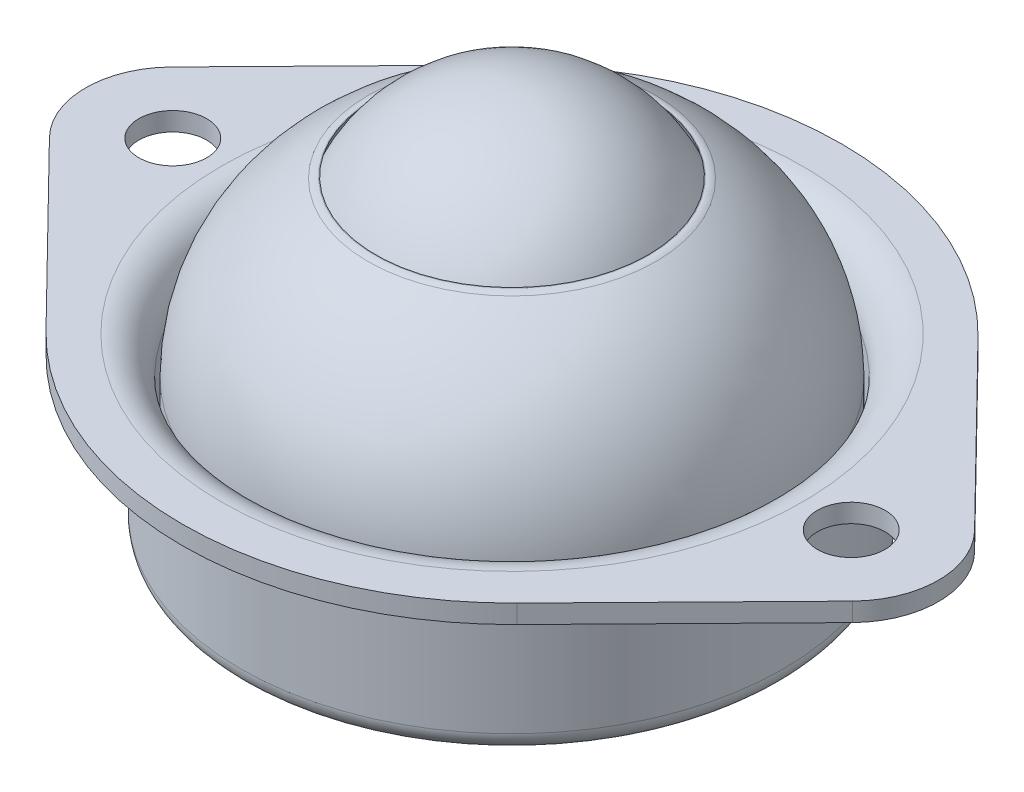
ISO-10303-21;
HEADER;
FILE_DESCRIPTION(('STEP AP214'),'2;1');
FILE_NAME('part.step','',(''),(''),'','','');
FILE_SCHEMA(('AUTOMOTIVE_DESIGN { 1 0 10303 214 1 1 1 1 }'));
ENDSEC;
DATA;
#1=APPLICATION_CONTEXT('core data for automotive mechanical design processes');
#2=APPLICATION_PROTOCOL_DEFINITION('international standard','automotive_design',2000,#1);
#3=PRODUCT_CONTEXT('',#1,'mechanical');
#4=PRODUCT('Part','Part','',(#3));
#5=PRODUCT_RELATED_PRODUCT_CATEGORY('part','',(#4));
#6=PRODUCT_DEFINITION_FORMATION('','',#4);
#7=PRODUCT_DEFINITION_CONTEXT('part definition',#1,'design');
#8=PRODUCT_DEFINITION('design','',#6,#7);
#9=PRODUCT_DEFINITION_SHAPE('','',#8);
#10=(LENGTH_UNIT() NAMED_UNIT(*) SI_UNIT(.MILLI.,.METRE.));
#11=(NAMED_UNIT(*) PLANE_ANGLE_UNIT() SI_UNIT($,.RADIAN.));
#12=(NAMED_UNIT(*) SI_UNIT($,.STERADIAN.) SOLID_ANGLE_UNIT());
#13=UNCERTAINTY_MEASURE_WITH_UNIT(LENGTH_MEASURE(1.E-05),#10,'distance_accuracy_value','');
#14=(GEOMETRIC_REPRESENTATION_CONTEXT(3) GLOBAL_UNCERTAINTY_ASSIGNED_CONTEXT((#13)) GLOBAL_UNIT_ASSIGNED_CONTEXT((#10,
#11,#12)) REPRESENTATION_CONTEXT('',''));
#15=CARTESIAN_POINT('',(0.,0.,0.));
#16=DIRECTION('',(0.,0.,1.));
#17=DIRECTION('',(1.,0.,0.));
#18=AXIS2_PLACEMENT_3D('',#15,#16,#17);
#19=CARTESIAN_POINT('',(0.,6.35,0.));
#20=DIRECTION('',(0.,1.,0.));
#21=DIRECTION('',(-1.,0.,0.));
#22=AXIS2_PLACEMENT_3D('',#19,#20,#21);
#23=SPHERICAL_SURFACE('',#22,12.7);
#24=CARTESIAN_POINT('',(0.,19.05,0.));
#25=VERTEX_POINT('',#24);
#26=VERTEX_LOOP('',#25);
#27=FACE_BOUND('',#26,.T.);
#28=ADVANCED_FACE('F50',(#27),#23,.T.);
#29=CLOSED_SHELL('',(#28));
#30=MANIFOLD_SOLID_BREP('B2',#29);
#31=CARTESIAN_POINT('',(0.,12.7,0.));
#32=DIRECTION('',(0.,-1.,0.));
#33=DIRECTION('',(1.,0.,0.));
#34=AXIS2_PLACEMENT_3D('',#31,#32,#33);
#35=PLANE('',#34);
#36=CARTESIAN_POINT('',(0.,12.7,0.));
#37=DIRECTION('',(0.,-1.,0.));
#38=DIRECTION('',(1.,0.,0.));
#39=AXIS2_PLACEMENT_3D('',#36,#37,#38);
#40=CIRCLE('',#39,11.2033802291708);
#41=CARTESIAN_POINT('',(11.2033802291708,12.7,0.));
#42=VERTEX_POINT('',#41);
#43=EDGE_CURVE('E74',#42,#42,#40,.F.);
#44=ORIENTED_EDGE('',*,*,#43,.T.);
#45=EDGE_LOOP('',(#44));
#46=FACE_BOUND('',#45,.T.);
#47=CARTESIAN_POINT('',(0.,12.7,0.));
#48=DIRECTION('',(0.,-1.,0.));
#49=DIRECTION('',(1.,0.,0.));
#50=AXIS2_PLACEMENT_3D('',#47,#48,#49);
#51=CIRCLE('',#50,11.1449283981549);
#52=CARTESIAN_POINT('',(11.1449283981549,12.7,0.));
#53=VERTEX_POINT('',#52);
#54=EDGE_CURVE('E218',#53,#53,#51,.F.);
#55=ORIENTED_EDGE('',*,*,#54,.F.);
#56=EDGE_LOOP('',(#55));
#57=FACE_BOUND('',#56,.T.);
#58=ADVANCED_FACE('F65',(#46,#57),#35,.F.);
#59=CARTESIAN_POINT('',(0.,-1.5875,0.));
#60=DIRECTION('',(0.,1.,0.));
#61=DIRECTION('',(-1.,0.,0.));
#62=AXIS2_PLACEMENT_3D('',#59,#60,#61);
#63=DEGENERATE_TOROIDAL_SURFACE('',#62,4.44714172976735,15.9363582702327,.T.);
#64=CARTESIAN_POINT('',(0.,12.5572208611973,0.));
#65=DIRECTION('',(0.,-1.,0.));
#66=DIRECTION('',(1.,0.,0.));
#67=AXIS2_PLACEMENT_3D('',#64,#65,#66);
#68=CIRCLE('',#67,11.7884213645464);
#69=CARTESIAN_POINT('',(11.7884213645464,12.5572208611973,0.));
#70=VERTEX_POINT('',#69);
#71=EDGE_CURVE('E48',#70,#70,#68,.T.);
#72=ORIENTED_EDGE('',*,*,#71,.T.);
#73=EDGE_LOOP('',(#72));
#74=FACE_BOUND('',#73,.T.);
#75=CARTESIAN_POINT('',(0.,-1.5875,0.));
#76=DIRECTION('',(0.,1.,0.));
#77=DIRECTION('',(-1.,0.,0.));
#78=AXIS2_PLACEMENT_3D('',#75,#76,#77);
#79=CIRCLE('',#78,20.3835);
#80=CARTESIAN_POINT('',(-20.3835,-1.5875,0.));
#81=VERTEX_POINT('',#80);
#82=EDGE_CURVE('E215',#81,#81,#79,.T.);
#83=ORIENTED_EDGE('',*,*,#82,.T.);
#84=EDGE_LOOP('',(#83));
#85=FACE_BOUND('',#84,.T.);
#86=ADVANCED_FACE('F236',(#74,#85),#63,.T.);
#87=CARTESIAN_POINT('',(0.,12.7,0.));
#88=DIRECTION('',(0.,1.,0.));
#89=DIRECTION('',(-1.,0.,0.));
#90=AXIS2_PLACEMENT_3D('',#87,#88,#89);
#91=CYLINDRICAL_SURFACE('',#90,20.3835);
#92=ORIENTED_EDGE('',*,*,#82,.F.);
#93=EDGE_LOOP('',(#92));
#94=FACE_BOUND('',#93,.T.);
#95=CARTESIAN_POINT('',(0.,-11.1125,0.));
#96=DIRECTION('',(0.,1.,0.));
#97=DIRECTION('',(-1.,0.,0.));
#98=AXIS2_PLACEMENT_3D('',#95,#96,#97);
#99=CIRCLE('',#98,20.3835);
#100=CARTESIAN_POINT('',(-20.3835,-11.1125,0.));
#101=VERTEX_POINT('',#100);
#102=EDGE_CURVE('E212',#101,#101,#99,.T.);
#103=ORIENTED_EDGE('',*,*,#102,.T.);
#104=EDGE_LOOP('',(#103));
#105=FACE_BOUND('',#104,.T.);
#106=ADVANCED_FACE('F241',(#94,#105),#91,.T.);
#107=CARTESIAN_POINT('',(0.,-11.1125,0.));
#108=DIRECTION('',(0.,1.,0.));
#109=DIRECTION('',(-1.,0.,0.));
#110=AXIS2_PLACEMENT_3D('',#107,#108,#109);
#111=TOROIDAL_SURFACE('',#110,20.54225,0.158750000000004);
#112=ORIENTED_EDGE('',*,*,#102,.F.);
#113=EDGE_LOOP('',(#112));
#114=FACE_BOUND('',#113,.T.);
#115=CARTESIAN_POINT('',(0.,-11.1125,0.));
#116=DIRECTION('',(0.,1.,0.));
#117=DIRECTION('',(-1.,0.,0.));
#118=AXIS2_PLACEMENT_3D('',#115,#116,#117);
#119=CIRCLE('',#118,20.701);
#120=CARTESIAN_POINT('',(-20.701,-11.1125,0.));
#121=VERTEX_POINT('',#120);
#122=EDGE_CURVE('E209',#121,#121,#119,.T.);
#123=ORIENTED_EDGE('',*,*,#122,.T.);
#124=EDGE_LOOP('',(#123));
#125=FACE_BOUND('',#124,.T.);
#126=ADVANCED_FACE('F271',(#114,#125),#111,.F.);
#127=CARTESIAN_POINT('',(0.,12.7,0.));
#128=DIRECTION('',(0.,1.,0.));
#129=DIRECTION('',(-1.,0.,0.));
#130=AXIS2_PLACEMENT_3D('',#127,#128,#129);
#131=CYLINDRICAL_SURFACE('',#130,20.701);
#132=ORIENTED_EDGE('',*,*,#122,.F.);
#133=EDGE_LOOP('',(#132));
#134=FACE_BOUND('',#133,.T.);
#135=CARTESIAN_POINT('',(0.,-1.5875,0.));
#136=DIRECTION('',(0.,1.,0.));
#137=DIRECTION('',(-1.,0.,0.));
#138=AXIS2_PLACEMENT_3D('',#135,#136,#137);
#139=CIRCLE('',#138,20.701);
#140=CARTESIAN_POINT('',(-20.701,-1.5875,0.));
#141=VERTEX_POINT('',#140);
#142=EDGE_CURVE('E206',#141,#141,#139,.T.);
#143=ORIENTED_EDGE('',*,*,#142,.T.);
#144=EDGE_LOOP('',(#143));
#145=FACE_BOUND('',#144,.T.);
#146=ADVANCED_FACE('F267',(#134,#145),#131,.F.);
#147=CARTESIAN_POINT('',(0.,-1.5875,0.));
#148=DIRECTION('',(0.,1.,0.));
#149=DIRECTION('',(-1.,0.,0.));
#150=AXIS2_PLACEMENT_3D('',#147,#148,#149);
#151=TOROIDAL_SURFACE('',#150,23.8125,3.1115);
#152=ORIENTED_EDGE('',*,*,#142,.F.);
#153=EDGE_LOOP('',(#152));
#154=FACE_BOUND('',#153,.T.);
#155=CARTESIAN_POINT('',(0.,1.524,0.));
#156=DIRECTION('',(0.,1.,0.));
#157=DIRECTION('',(0.,0.,1.));
#158=AXIS2_PLACEMENT_3D('',#155,#156,#157);
#159=CIRCLE('',#158,23.8125);
#160=CARTESIAN_POINT('',(0.,1.524,23.8125));
#161=VERTEX_POINT('',#160);
#162=EDGE_CURVE('E220',#161,#161,#159,.T.);
#163=ORIENTED_EDGE('',*,*,#162,.T.);
#164=EDGE_LOOP('',(#163));
#165=FACE_BOUND('',#164,.T.);
#166=ADVANCED_FACE('F264',(#154,#165),#151,.T.);
#167=CARTESIAN_POINT('',(-27.78125,1.524,0.));
#168=DIRECTION('',(0.,1.,0.));
#169=DIRECTION('',(0.,0.,1.));
#170=AXIS2_PLACEMENT_3D('',#167,#168,#169);
#171=PLANE('',#170);
#172=ORIENTED_EDGE('',*,*,#162,.F.);
#173=EDGE_LOOP('',(#172));
#174=FACE_BOUND('',#173,.T.);
#175=CARTESIAN_POINT('',(-27.78125,1.524,0.));
#176=DIRECTION('',(0.,1.,0.));
#177=DIRECTION('',(0.,0.,1.));
#178=AXIS2_PLACEMENT_3D('',#175,#176,#177);
#179=CIRCLE('',#178,2.778125);
#180=CARTESIAN_POINT('',(-27.78125,1.524,-2.778125));
#181=VERTEX_POINT('',#180);
#182=EDGE_CURVE('E168',#181,#181,#179,.T.);
#183=ORIENTED_EDGE('',*,*,#182,.F.);
#184=EDGE_LOOP('',(#183));
#185=FACE_BOUND('',#184,.T.);
#186=CARTESIAN_POINT('',(-27.78125,1.524,0.));
#187=DIRECTION('',(0.,1.,0.));
#188=DIRECTION('',(0.,0.,1.));
#189=AXIS2_PLACEMENT_3D('',#186,#187,#188);
#190=CIRCLE('',#189,7.14375);
#191=CARTESIAN_POINT('',(-32.8839285714286,1.524,-4.99958352857352));
#192=VERTEX_POINT('',#191);
#193=CARTESIAN_POINT('',(-32.8839285714286,1.524,4.99958352857352));
#194=VERTEX_POINT('',#193);
#195=EDGE_CURVE('E179',#192,#194,#190,.T.);
#196=ORIENTED_EDGE('',*,*,#195,.T.);
#197=DIRECTION('',(0.699854212223765,0.,0.714285714285714));
#198=VECTOR('',#197,1.);
#199=CARTESIAN_POINT('',(-19.2767857142857,1.524,18.8873155523889));
#200=LINE('',#199,#198);
#201=CARTESIAN_POINT('',(-19.2767857142857,1.524,18.8873155523889));
#202=VERTEX_POINT('',#201);
#203=EDGE_CURVE('E126',#194,#202,#200,.T.);
#204=ORIENTED_EDGE('',*,*,#203,.T.);
#205=CARTESIAN_POINT('',(0.,1.524,0.));
#206=DIRECTION('',(0.,1.,0.));
#207=DIRECTION('',(0.,0.,1.));
#208=AXIS2_PLACEMENT_3D('',#205,#206,#207);
#209=CIRCLE('',#208,26.9875);
#210=CARTESIAN_POINT('',(19.2767857142857,1.524,18.8873155523889));
#211=VERTEX_POINT('',#210);
#212=EDGE_CURVE('E306',#202,#211,#209,.T.);
#213=ORIENTED_EDGE('',*,*,#212,.T.);
#214=DIRECTION('',(0.699854212223765,0.,-0.714285714285714));
#215=VECTOR('',#214,1.);
#216=CARTESIAN_POINT('',(32.8839285714286,1.524,4.99958352857352));
#217=LINE('',#216,#215);
#218=CARTESIAN_POINT('',(32.8839285714286,1.524,4.99958352857353));
#219=VERTEX_POINT('',#218);
#220=EDGE_CURVE('E308',#211,#219,#217,.T.);
#221=ORIENTED_EDGE('',*,*,#220,.T.);
#222=CARTESIAN_POINT('',(27.78125,1.524,0.));
#223=DIRECTION('',(0.,1.,0.));
#224=DIRECTION('',(0.,0.,1.));
#225=AXIS2_PLACEMENT_3D('',#222,#223,#224);
#226=CIRCLE('',#225,7.14375);
#227=CARTESIAN_POINT('',(32.8839285714286,1.524,-4.99958352857352));
#228=VERTEX_POINT('',#227);
#229=EDGE_CURVE('E146',#219,#228,#226,.T.);
#230=ORIENTED_EDGE('',*,*,#229,.T.);
#231=DIRECTION('',(-0.699854212223765,0.,-0.714285714285714));
#232=VECTOR('',#231,1.);
#233=CARTESIAN_POINT('',(19.2767857142857,1.524,-18.8873155523889));
#234=LINE('',#233,#232);
#235=CARTESIAN_POINT('',(19.2767857142857,1.524,-18.8873155523889));
#236=VERTEX_POINT('',#235);
#237=EDGE_CURVE('E139',#228,#236,#234,.T.);
#238=ORIENTED_EDGE('',*,*,#237,.T.);
#239=CARTESIAN_POINT('',(0.,1.524,0.));
#240=DIRECTION('',(0.,1.,0.));
#241=DIRECTION('',(0.,0.,1.));
#242=AXIS2_PLACEMENT_3D('',#239,#240,#241);
#243=CIRCLE('',#242,26.9875);
#244=CARTESIAN_POINT('',(-19.2767857142857,1.524,-18.8873155523889));
#245=VERTEX_POINT('',#244);
#246=EDGE_CURVE('E144',#236,#245,#243,.T.);
#247=ORIENTED_EDGE('',*,*,#246,.T.);
#248=DIRECTION('',(-0.699854212223765,0.,0.714285714285714));
#249=VECTOR('',#248,1.);
#250=CARTESIAN_POINT('',(-32.8839285714286,1.524,-4.99958352857352));
#251=LINE('',#250,#249);
#252=EDGE_CURVE('E82',#245,#192,#251,.T.);
#253=ORIENTED_EDGE('',*,*,#252,.T.);
#254=EDGE_LOOP('',(#196,#204,#213,#221,#230,#238,#247,#253));
#255=FACE_BOUND('',#254,.T.);
#256=CARTESIAN_POINT('',(27.78125,1.524,0.));
#257=DIRECTION('',(0.,1.,0.));
#258=DIRECTION('',(0.,0.,1.));
#259=AXIS2_PLACEMENT_3D('',#256,#257,#258);
#260=CIRCLE('',#259,2.778125);
#261=CARTESIAN_POINT('',(27.78125,1.524,-2.778125));
#262=VERTEX_POINT('',#261);
#263=EDGE_CURVE('E294',#262,#262,#260,.T.);
#264=ORIENTED_EDGE('',*,*,#263,.F.);
#265=EDGE_LOOP('',(#264));
#266=FACE_BOUND('',#265,.T.);
#267=ADVANCED_FACE('F141',(#174,#185,#255,#266),#171,.T.);
#268=CARTESIAN_POINT('',(-27.78125,0.,0.));
#269=DIRECTION('',(0.,1.,0.));
#270=DIRECTION('',(0.,0.,1.));
#271=AXIS2_PLACEMENT_3D('',#268,#269,#270);
#272=PLANE('',#271);
#273=CARTESIAN_POINT('',(0.,0.,0.));
#274=DIRECTION('',(0.,1.,0.));
#275=DIRECTION('',(-1.,0.,0.));
#276=AXIS2_PLACEMENT_3D('',#273,#274,#275);
#277=CIRCLE('',#276,23.8125);
#278=CARTESIAN_POINT('',(-23.8125,0.,0.));
#279=VERTEX_POINT('',#278);
#280=EDGE_CURVE('E203',#279,#279,#277,.T.);
#281=ORIENTED_EDGE('',*,*,#280,.T.);
#282=EDGE_LOOP('',(#281));
#283=FACE_BOUND('',#282,.T.);
#284=CARTESIAN_POINT('',(-27.78125,0.,0.));
#285=DIRECTION('',(0.,1.,0.));
#286=DIRECTION('',(0.,0.,1.));
#287=AXIS2_PLACEMENT_3D('',#284,#285,#286);
#288=CIRCLE('',#287,2.778125);
#289=CARTESIAN_POINT('',(-27.78125,0.,-2.778125));
#290=VERTEX_POINT('',#289);
#291=EDGE_CURVE('E298',#290,#290,#288,.T.);
#292=ORIENTED_EDGE('',*,*,#291,.T.);
#293=EDGE_LOOP('',(#292));
#294=FACE_BOUND('',#293,.T.);
#295=CARTESIAN_POINT('',(-27.78125,0.,0.));
#296=DIRECTION('',(0.,1.,0.));
#297=DIRECTION('',(0.,0.,1.));
#298=AXIS2_PLACEMENT_3D('',#295,#296,#297);
#299=CIRCLE('',#298,7.14375);
#300=CARTESIAN_POINT('',(-32.8839285714286,0.,-4.99958352857352));
#301=VERTEX_POINT('',#300);
#302=CARTESIAN_POINT('',(-32.8839285714286,0.,4.99958352857352));
#303=VERTEX_POINT('',#302);
#304=EDGE_CURVE('E164',#301,#303,#299,.T.);
#305=ORIENTED_EDGE('',*,*,#304,.F.);
#306=DIRECTION('',(-0.699854212223765,0.,0.714285714285714));
#307=VECTOR('',#306,1.);
#308=CARTESIAN_POINT('',(-32.8839285714286,0.,-4.99958352857352));
#309=LINE('',#308,#307);
#310=CARTESIAN_POINT('',(-19.2767857142857,0.,-18.8873155523889));
#311=VERTEX_POINT('',#310);
#312=EDGE_CURVE('E117',#311,#301,#309,.T.);
#313=ORIENTED_EDGE('',*,*,#312,.F.);
#314=CARTESIAN_POINT('',(0.,0.,0.));
#315=DIRECTION('',(0.,1.,0.));
#316=DIRECTION('',(0.,0.,1.));
#317=AXIS2_PLACEMENT_3D('',#314,#315,#316);
#318=CIRCLE('',#317,26.9875);
#319=CARTESIAN_POINT('',(19.2767857142857,0.,-18.8873155523889));
#320=VERTEX_POINT('',#319);
#321=EDGE_CURVE('E111',#320,#311,#318,.T.);
#322=ORIENTED_EDGE('',*,*,#321,.F.);
#323=DIRECTION('',(-0.699854212223765,0.,-0.714285714285714));
#324=VECTOR('',#323,1.);
#325=CARTESIAN_POINT('',(19.2767857142857,0.,-18.8873155523889));
#326=LINE('',#325,#324);
#327=CARTESIAN_POINT('',(32.8839285714286,0.,-4.99958352857352));
#328=VERTEX_POINT('',#327);
#329=EDGE_CURVE('E154',#328,#320,#326,.T.);
#330=ORIENTED_EDGE('',*,*,#329,.F.);
#331=CARTESIAN_POINT('',(27.78125,0.,0.));
#332=DIRECTION('',(0.,1.,0.));
#333=DIRECTION('',(0.,0.,1.));
#334=AXIS2_PLACEMENT_3D('',#331,#332,#333);
#335=CIRCLE('',#334,7.14375);
#336=CARTESIAN_POINT('',(32.8839285714286,0.,4.99958352857353));
#337=VERTEX_POINT('',#336);
#338=EDGE_CURVE('E174',#337,#328,#335,.T.);
#339=ORIENTED_EDGE('',*,*,#338,.F.);
#340=DIRECTION('',(0.699854212223765,0.,-0.714285714285714));
#341=VECTOR('',#340,1.);
#342=CARTESIAN_POINT('',(32.8839285714286,0.,4.99958352857352));
#343=LINE('',#342,#341);
#344=CARTESIAN_POINT('',(19.2767857142857,0.,18.8873155523889));
#345=VERTEX_POINT('',#344);
#346=EDGE_CURVE('E172',#345,#337,#343,.T.);
#347=ORIENTED_EDGE('',*,*,#346,.F.);
#348=CARTESIAN_POINT('',(0.,0.,0.));
#349=DIRECTION('',(0.,1.,0.));
#350=DIRECTION('',(0.,0.,1.));
#351=AXIS2_PLACEMENT_3D('',#348,#349,#350);
#352=CIRCLE('',#351,26.9875);
#353=CARTESIAN_POINT('',(-19.2767857142857,0.,18.8873155523889));
#354=VERTEX_POINT('',#353);
#355=EDGE_CURVE('E170',#354,#345,#352,.T.);
#356=ORIENTED_EDGE('',*,*,#355,.F.);
#357=DIRECTION('',(0.699854212223765,0.,0.714285714285714));
#358=VECTOR('',#357,1.);
#359=CARTESIAN_POINT('',(-19.2767857142857,0.,18.8873155523889));
#360=LINE('',#359,#358);
#361=EDGE_CURVE('E167',#303,#354,#360,.T.);
#362=ORIENTED_EDGE('',*,*,#361,.F.);
#363=EDGE_LOOP('',(#305,#313,#322,#330,#339,#347,#356,#362));
#364=FACE_BOUND('',#363,.T.);
#365=CARTESIAN_POINT('',(27.78125,0.,0.));
#366=DIRECTION('',(0.,1.,0.));
#367=DIRECTION('',(0.,0.,1.));
#368=AXIS2_PLACEMENT_3D('',#365,#366,#367);
#369=CIRCLE('',#368,2.778125);
#370=CARTESIAN_POINT('',(27.78125,0.,-2.778125));
#371=VERTEX_POINT('',#370);
#372=EDGE_CURVE('E291',#371,#371,#369,.T.);
#373=ORIENTED_EDGE('',*,*,#372,.T.);
#374=EDGE_LOOP('',(#373));
#375=FACE_BOUND('',#374,.T.);
#376=ADVANCED_FACE('F321',(#283,#294,#364,#375),#272,.F.);
#377=CARTESIAN_POINT('',(-27.78125,1.524,0.));
#378=DIRECTION('',(0.,-1.,0.));
#379=DIRECTION('',(0.,0.,-1.));
#380=AXIS2_PLACEMENT_3D('',#377,#378,#379);
#381=CYLINDRICAL_SURFACE('',#380,7.14375);
#382=ORIENTED_EDGE('',*,*,#304,.T.);
#383=DIRECTION('',(0.,-1.,0.));
#384=VECTOR('',#383,1.);
#385=CARTESIAN_POINT('',(-32.8839285714286,1.524,4.99958352857352));
#386=LINE('',#385,#384);
#387=EDGE_CURVE('E192',#194,#303,#386,.T.);
#388=ORIENTED_EDGE('',*,*,#387,.F.);
#389=ORIENTED_EDGE('',*,*,#195,.F.);
#390=DIRECTION('',(0.,-1.,0.));
#391=VECTOR('',#390,1.);
#392=CARTESIAN_POINT('',(-32.8839285714286,1.524,-4.99958352857352));
#393=LINE('',#392,#391);
#394=EDGE_CURVE('E160',#192,#301,#393,.T.);
#395=ORIENTED_EDGE('',*,*,#394,.T.);
#396=EDGE_LOOP('',(#382,#388,#389,#395));
#397=FACE_BOUND('',#396,.T.);
#398=ADVANCED_FACE('F246',(#397),#381,.T.);
#399=CARTESIAN_POINT('',(-19.2767857142857,1.524,18.8873155523889));
#400=DIRECTION('',(0.714285714285714,0.,-0.699854212223765));
#401=DIRECTION('',(-0.699854212223765,0.,-0.714285714285714));
#402=AXIS2_PLACEMENT_3D('',#399,#400,#401);
#403=PLANE('',#402);
#404=ORIENTED_EDGE('',*,*,#361,.T.);
#405=DIRECTION('',(0.,-1.,0.));
#406=VECTOR('',#405,1.);
#407=CARTESIAN_POINT('',(-19.2767857142857,1.524,18.8873155523889));
#408=LINE('',#407,#406);
#409=EDGE_CURVE('E189',#202,#354,#408,.T.);
#410=ORIENTED_EDGE('',*,*,#409,.F.);
#411=ORIENTED_EDGE('',*,*,#203,.F.);
#412=ORIENTED_EDGE('',*,*,#387,.T.);
#413=EDGE_LOOP('',(#404,#410,#411,#412));
#414=FACE_BOUND('',#413,.T.);
#415=ADVANCED_FACE('F349',(#414),#403,.F.);
#416=CARTESIAN_POINT('',(0.,1.524,0.));
#417=DIRECTION('',(0.,-1.,0.));
#418=DIRECTION('',(0.,0.,-1.));
#419=AXIS2_PLACEMENT_3D('',#416,#417,#418);
#420=CYLINDRICAL_SURFACE('',#419,26.9875);
#421=ORIENTED_EDGE('',*,*,#355,.T.);
#422=DIRECTION('',(0.,-1.,0.));
#423=VECTOR('',#422,1.);
#424=CARTESIAN_POINT('',(19.2767857142857,1.524,18.8873155523889));
#425=LINE('',#424,#423);
#426=EDGE_CURVE('E186',#211,#345,#425,.T.);
#427=ORIENTED_EDGE('',*,*,#426,.F.);
#428=ORIENTED_EDGE('',*,*,#212,.F.);
#429=ORIENTED_EDGE('',*,*,#409,.T.);
#430=EDGE_LOOP('',(#421,#427,#428,#429));
#431=FACE_BOUND('',#430,.T.);
#432=ADVANCED_FACE('F347',(#431),#420,.T.);
#433=CARTESIAN_POINT('',(32.8839285714286,1.524,4.99958352857352));
#434=DIRECTION('',(-0.714285714285714,0.,-0.699854212223765));
#435=DIRECTION('',(-0.699854212223765,0.,0.714285714285714));
#436=AXIS2_PLACEMENT_3D('',#433,#434,#435);
#437=PLANE('',#436);
#438=ORIENTED_EDGE('',*,*,#346,.T.);
#439=DIRECTION('',(0.,-1.,0.));
#440=VECTOR('',#439,1.);
#441=CARTESIAN_POINT('',(32.8839285714286,1.524,4.99958352857353));
#442=LINE('',#441,#440);
#443=EDGE_CURVE('E183',#219,#337,#442,.T.);
#444=ORIENTED_EDGE('',*,*,#443,.F.);
#445=ORIENTED_EDGE('',*,*,#220,.F.);
#446=ORIENTED_EDGE('',*,*,#426,.T.);
#447=EDGE_LOOP('',(#438,#444,#445,#446));
#448=FACE_BOUND('',#447,.T.);
#449=ADVANCED_FACE('F314',(#448),#437,.F.);
#450=CARTESIAN_POINT('',(27.78125,1.524,0.));
#451=DIRECTION('',(0.,-1.,0.));
#452=DIRECTION('',(0.,0.,-1.));
#453=AXIS2_PLACEMENT_3D('',#450,#451,#452);
#454=CYLINDRICAL_SURFACE('',#453,7.14375);
#455=ORIENTED_EDGE('',*,*,#338,.T.);
#456=DIRECTION('',(0.,-1.,0.));
#457=VECTOR('',#456,1.);
#458=CARTESIAN_POINT('',(32.8839285714286,1.524,-4.99958352857352));
#459=LINE('',#458,#457);
#460=EDGE_CURVE('E155',#228,#328,#459,.T.);
#461=ORIENTED_EDGE('',*,*,#460,.F.);
#462=ORIENTED_EDGE('',*,*,#229,.F.);
#463=ORIENTED_EDGE('',*,*,#443,.T.);
#464=EDGE_LOOP('',(#455,#461,#462,#463));
#465=FACE_BOUND('',#464,.T.);
#466=ADVANCED_FACE('F318',(#465),#454,.T.);
#467=CARTESIAN_POINT('',(19.2767857142857,1.524,-18.8873155523889));
#468=DIRECTION('',(-0.714285714285714,0.,0.699854212223765));
#469=DIRECTION('',(0.699854212223765,0.,0.714285714285714));
#470=AXIS2_PLACEMENT_3D('',#467,#468,#469);
#471=PLANE('',#470);
#472=ORIENTED_EDGE('',*,*,#329,.T.);
#473=DIRECTION('',(0.,-1.,0.));
#474=VECTOR('',#473,1.);
#475=CARTESIAN_POINT('',(19.2767857142857,1.524,-18.8873155523889));
#476=LINE('',#475,#474);
#477=EDGE_CURVE('E151',#236,#320,#476,.T.);
#478=ORIENTED_EDGE('',*,*,#477,.F.);
#479=ORIENTED_EDGE('',*,*,#237,.F.);
#480=ORIENTED_EDGE('',*,*,#460,.T.);
#481=EDGE_LOOP('',(#472,#478,#479,#480));
#482=FACE_BOUND('',#481,.T.);
#483=ADVANCED_FACE('F152',(#482),#471,.F.);
#484=CARTESIAN_POINT('',(0.,1.524,0.));
#485=DIRECTION('',(0.,-1.,0.));
#486=DIRECTION('',(0.,0.,-1.));
#487=AXIS2_PLACEMENT_3D('',#484,#485,#486);
#488=CYLINDRICAL_SURFACE('',#487,26.9875);
#489=ORIENTED_EDGE('',*,*,#321,.T.);
#490=DIRECTION('',(0.,-1.,0.));
#491=VECTOR('',#490,1.);
#492=CARTESIAN_POINT('',(-19.2767857142857,1.524,-18.8873155523889));
#493=LINE('',#492,#491);
#494=EDGE_CURVE('E156',#245,#311,#493,.T.);
#495=ORIENTED_EDGE('',*,*,#494,.F.);
#496=ORIENTED_EDGE('',*,*,#246,.F.);
#497=ORIENTED_EDGE('',*,*,#477,.T.);
#498=EDGE_LOOP('',(#489,#495,#496,#497));
#499=FACE_BOUND('',#498,.T.);
#500=ADVANCED_FACE('F158',(#499),#488,.T.);
#501=CARTESIAN_POINT('',(-32.8839285714286,1.524,-4.99958352857352));
#502=DIRECTION('',(0.714285714285714,0.,0.699854212223765));
#503=DIRECTION('',(0.699854212223765,0.,-0.714285714285714));
#504=AXIS2_PLACEMENT_3D('',#501,#502,#503);
#505=PLANE('',#504);
#506=ORIENTED_EDGE('',*,*,#312,.T.);
#507=ORIENTED_EDGE('',*,*,#394,.F.);
#508=ORIENTED_EDGE('',*,*,#252,.F.);
#509=ORIENTED_EDGE('',*,*,#494,.T.);
#510=EDGE_LOOP('',(#506,#507,#508,#509));
#511=FACE_BOUND('',#510,.T.);
#512=ADVANCED_FACE('F327',(#511),#505,.F.);
#513=CARTESIAN_POINT('',(-27.78125,1.524,0.));
#514=DIRECTION('',(0.,-1.,0.));
#515=DIRECTION('',(0.,0.,-1.));
#516=AXIS2_PLACEMENT_3D('',#513,#514,#515);
#517=CYLINDRICAL_SURFACE('',#516,2.778125);
#518=CARTESIAN_POINT('',(-27.78125,1.524,-2.778125));
#519=CARTESIAN_POINT('',(-27.78125,1.508125,-2.778125));
#520=CARTESIAN_POINT('',(-27.78125,1.49225,-2.778125));
#521=CARTESIAN_POINT('',(-27.78125,1.4605,-2.778125));
#522=CARTESIAN_POINT('',(-27.78125,1.444625,-2.778125));
#523=CARTESIAN_POINT('',(-27.78125,1.412875,-2.778125));
#524=CARTESIAN_POINT('',(-27.78125,1.397,-2.778125));
#525=CARTESIAN_POINT('',(-27.78125,1.36525,-2.778125));
#526=CARTESIAN_POINT('',(-27.78125,1.349375,-2.778125));
#527=CARTESIAN_POINT('',(-27.78125,1.317625,-2.778125));
#528=CARTESIAN_POINT('',(-27.78125,1.30175,-2.778125));
#529=CARTESIAN_POINT('',(-27.78125,1.27,-2.778125));
#530=CARTESIAN_POINT('',(-27.78125,1.254125,-2.778125));
#531=CARTESIAN_POINT('',(-27.78125,1.222375,-2.778125));
#532=CARTESIAN_POINT('',(-27.78125,1.2065,-2.778125));
#533=CARTESIAN_POINT('',(-27.78125,1.17475,-2.778125));
#534=CARTESIAN_POINT('',(-27.78125,1.158875,-2.778125));
#535=CARTESIAN_POINT('',(-27.78125,1.127125,-2.778125));
#536=CARTESIAN_POINT('',(-27.78125,1.11125,-2.778125));
#537=CARTESIAN_POINT('',(-27.78125,1.0795,-2.778125));
#538=CARTESIAN_POINT('',(-27.78125,1.063625,-2.778125));
#539=CARTESIAN_POINT('',(-27.78125,1.031875,-2.778125));
#540=CARTESIAN_POINT('',(-27.78125,1.016,-2.778125));
#541=CARTESIAN_POINT('',(-27.78125,0.98425,-2.778125));
#542=CARTESIAN_POINT('',(-27.78125,0.968375,-2.778125));
#543=CARTESIAN_POINT('',(-27.78125,0.936625,-2.778125));
#544=CARTESIAN_POINT('',(-27.78125,0.92075,-2.778125));
#545=CARTESIAN_POINT('',(-27.78125,0.889,-2.778125));
#546=CARTESIAN_POINT('',(-27.78125,0.873125,-2.778125));
#547=CARTESIAN_POINT('',(-27.78125,0.841375,-2.778125));
#548=CARTESIAN_POINT('',(-27.78125,0.8255,-2.778125));
#549=CARTESIAN_POINT('',(-27.78125,0.79375,-2.778125));
#550=CARTESIAN_POINT('',(-27.78125,0.777875,-2.778125));
#551=CARTESIAN_POINT('',(-27.78125,0.746125,-2.778125));
#552=CARTESIAN_POINT('',(-27.78125,0.73025,-2.778125));
#553=CARTESIAN_POINT('',(-27.78125,0.6985,-2.778125));
#554=CARTESIAN_POINT('',(-27.78125,0.682625,-2.778125));
#555=CARTESIAN_POINT('',(-27.78125,0.650875,-2.778125));
#556=CARTESIAN_POINT('',(-27.78125,0.635,-2.778125));
#557=CARTESIAN_POINT('',(-27.78125,0.60325,-2.778125));
#558=CARTESIAN_POINT('',(-27.78125,0.587375,-2.778125));
#559=CARTESIAN_POINT('',(-27.78125,0.555625,-2.778125));
#560=CARTESIAN_POINT('',(-27.78125,0.53975,-2.778125));
#561=CARTESIAN_POINT('',(-27.78125,0.508,-2.778125));
#562=CARTESIAN_POINT('',(-27.78125,0.492125,-2.778125));
#563=CARTESIAN_POINT('',(-27.78125,0.460375,-2.778125));
#564=CARTESIAN_POINT('',(-27.78125,0.4445,-2.778125));
#565=CARTESIAN_POINT('',(-27.78125,0.41275,-2.778125));
#566=CARTESIAN_POINT('',(-27.78125,0.396875,-2.778125));
#567=CARTESIAN_POINT('',(-27.78125,0.365125,-2.778125));
#568=CARTESIAN_POINT('',(-27.78125,0.34925,-2.778125));
#569=CARTESIAN_POINT('',(-27.78125,0.3175,-2.778125));
#570=CARTESIAN_POINT('',(-27.78125,0.301625,-2.778125));
#571=CARTESIAN_POINT('',(-27.78125,0.269875,-2.778125));
#572=CARTESIAN_POINT('',(-27.78125,0.254,-2.778125));
#573=CARTESIAN_POINT('',(-27.78125,0.22225,-2.778125));
#574=CARTESIAN_POINT('',(-27.78125,0.206375,-2.778125));
#575=CARTESIAN_POINT('',(-27.78125,0.174625,-2.778125));
#576=CARTESIAN_POINT('',(-27.78125,0.15875,-2.778125));
#577=CARTESIAN_POINT('',(-27.78125,0.127,-2.778125));
#578=CARTESIAN_POINT('',(-27.78125,0.111125,-2.778125));
#579=CARTESIAN_POINT('',(-27.78125,0.079375,-2.778125));
#580=CARTESIAN_POINT('',(-27.78125,0.0635,-2.778125));
#581=CARTESIAN_POINT('',(-27.78125,0.0317499999999999,-2.778125));
#582=CARTESIAN_POINT('',(-27.78125,0.015875,-2.778125));
#583=CARTESIAN_POINT('',(-27.78125,0.,-2.778125));
#584=B_SPLINE_CURVE_WITH_KNOTS('',3,(#518,#519,#520,#521,#522,#523,#524,#525,#526,#527,#528,
#529,#530,#531,#532,#533,#534,#535,#536,#537,#538,#539,#540,#541,#542,#543,#544,#545,#546,#547,
#548,#549,#550,#551,#552,#553,#554,#555,#556,#557,#558,#559,#560,#561,#562,#563,#564,#565,#566,
#567,#568,#569,#570,#571,#572,#573,#574,#575,#576,#577,#578,#579,#580,#581,#582,#583),
.UNSPECIFIED.,.F.,.F.,(4,2,2,2,2,2,2,2,2,2,2,2,2,2,2,2,2,2,2,2,2,2,2,2,2,2,2,2,2,2,2,2,4),(0.,
0.0476250000000001,0.0952500000000001,0.142875,0.1905,0.238125,0.28575,0.333375,0.381,0.428625,
0.47625,0.523875,0.5715,0.619125,0.66675,0.714375,0.762,0.809625,0.85725,0.904875,0.9525,
1.000125,1.04775,1.095375,1.143,1.190625,1.23825,1.285875,1.3335,1.381125,1.42875,1.476375,
1.524),.UNSPECIFIED.);
#585=EDGE_CURVE('BSEAM329',#181,#290,#584,.T.);
#586=ORIENTED_EDGE('',*,*,#182,.T.);
#587=ORIENTED_EDGE('',*,*,#291,.F.);
#588=ORIENTED_EDGE('',*,*,#585,.T.);
#589=ORIENTED_EDGE('',*,*,#585,.F.);
#590=EDGE_LOOP('',(#586,#588,#587,#589));
#591=FACE_BOUND('',#590,.T.);
#592=ADVANCED_FACE('F329',(#591),#517,.F.);
#593=CARTESIAN_POINT('',(27.78125,1.524,0.));
#594=DIRECTION('',(0.,-1.,0.));
#595=DIRECTION('',(0.,0.,-1.));
#596=AXIS2_PLACEMENT_3D('',#593,#594,#595);
#597=CYLINDRICAL_SURFACE('',#596,2.778125);
#598=CARTESIAN_POINT('',(27.78125,1.524,-2.778125));
#599=CARTESIAN_POINT('',(27.78125,1.508125,-2.778125));
#600=CARTESIAN_POINT('',(27.78125,1.49225,-2.778125));
#601=CARTESIAN_POINT('',(27.78125,1.4605,-2.778125));
#602=CARTESIAN_POINT('',(27.78125,1.444625,-2.778125));
#603=CARTESIAN_POINT('',(27.78125,1.412875,-2.778125));
#604=CARTESIAN_POINT('',(27.78125,1.397,-2.778125));
#605=CARTESIAN_POINT('',(27.78125,1.36525,-2.778125));
#606=CARTESIAN_POINT('',(27.78125,1.349375,-2.778125));
#607=CARTESIAN_POINT('',(27.78125,1.317625,-2.778125));
#608=CARTESIAN_POINT('',(27.78125,1.30175,-2.778125));
#609=CARTESIAN_POINT('',(27.78125,1.27,-2.778125));
#610=CARTESIAN_POINT('',(27.78125,1.254125,-2.778125));
#611=CARTESIAN_POINT('',(27.78125,1.222375,-2.778125));
#612=CARTESIAN_POINT('',(27.78125,1.2065,-2.778125));
#613=CARTESIAN_POINT('',(27.78125,1.17475,-2.778125));
#614=CARTESIAN_POINT('',(27.78125,1.158875,-2.778125));
#615=CARTESIAN_POINT('',(27.78125,1.127125,-2.778125));
#616=CARTESIAN_POINT('',(27.78125,1.11125,-2.778125));
#617=CARTESIAN_POINT('',(27.78125,1.0795,-2.778125));
#618=CARTESIAN_POINT('',(27.78125,1.063625,-2.778125));
#619=CARTESIAN_POINT('',(27.78125,1.031875,-2.778125));
#620=CARTESIAN_POINT('',(27.78125,1.016,-2.778125));
#621=CARTESIAN_POINT('',(27.78125,0.98425,-2.778125));
#622=CARTESIAN_POINT('',(27.78125,0.968375,-2.778125));
#623=CARTESIAN_POINT('',(27.78125,0.936625,-2.778125));
#624=CARTESIAN_POINT('',(27.78125,0.92075,-2.778125));
#625=CARTESIAN_POINT('',(27.78125,0.889,-2.778125));
#626=CARTESIAN_POINT('',(27.78125,0.873125,-2.778125));
#627=CARTESIAN_POINT('',(27.78125,0.841375,-2.778125));
#628=CARTESIAN_POINT('',(27.78125,0.8255,-2.778125));
#629=CARTESIAN_POINT('',(27.78125,0.79375,-2.778125));
#630=CARTESIAN_POINT('',(27.78125,0.777875,-2.778125));
#631=CARTESIAN_POINT('',(27.78125,0.746125,-2.778125));
#632=CARTESIAN_POINT('',(27.78125,0.73025,-2.778125));
#633=CARTESIAN_POINT('',(27.78125,0.6985,-2.778125));
#634=CARTESIAN_POINT('',(27.78125,0.682625,-2.778125));
#635=CARTESIAN_POINT('',(27.78125,0.650875,-2.778125));
#636=CARTESIAN_POINT('',(27.78125,0.635,-2.778125));
#637=CARTESIAN_POINT('',(27.78125,0.60325,-2.778125));
#638=CARTESIAN_POINT('',(27.78125,0.587375,-2.778125));
#639=CARTESIAN_POINT('',(27.78125,0.555625,-2.778125));
#640=CARTESIAN_POINT('',(27.78125,0.53975,-2.778125));
#641=CARTESIAN_POINT('',(27.78125,0.508,-2.778125));
#642=CARTESIAN_POINT('',(27.78125,0.492125,-2.778125));
#643=CARTESIAN_POINT('',(27.78125,0.460375,-2.778125));
#644=CARTESIAN_POINT('',(27.78125,0.4445,-2.778125));
#645=CARTESIAN_POINT('',(27.78125,0.41275,-2.778125));
#646=CARTESIAN_POINT('',(27.78125,0.396875,-2.778125));
#647=CARTESIAN_POINT('',(27.78125,0.365125,-2.778125));
#648=CARTESIAN_POINT('',(27.78125,0.34925,-2.778125));
#649=CARTESIAN_POINT('',(27.78125,0.3175,-2.778125));
#650=CARTESIAN_POINT('',(27.78125,0.301625,-2.778125));
#651=CARTESIAN_POINT('',(27.78125,0.269875,-2.778125));
#652=CARTESIAN_POINT('',(27.78125,0.254,-2.778125));
#653=CARTESIAN_POINT('',(27.78125,0.22225,-2.778125));
#654=CARTESIAN_POINT('',(27.78125,0.206375,-2.778125));
#655=CARTESIAN_POINT('',(27.78125,0.174625,-2.778125));
#656=CARTESIAN_POINT('',(27.78125,0.15875,-2.778125));
#657=CARTESIAN_POINT('',(27.78125,0.127,-2.778125));
#658=CARTESIAN_POINT('',(27.78125,0.111125,-2.778125));
#659=CARTESIAN_POINT('',(27.78125,0.079375,-2.778125));
#660=CARTESIAN_POINT('',(27.78125,0.0635,-2.778125));
#661=CARTESIAN_POINT('',(27.78125,0.0317499999999999,-2.778125));
#662=CARTESIAN_POINT('',(27.78125,0.015875,-2.778125));
#663=CARTESIAN_POINT('',(27.78125,0.,-2.778125));
#664=B_SPLINE_CURVE_WITH_KNOTS('',3,(#598,#599,#600,#601,#602,#603,#604,#605,#606,#607,#608,
#609,#610,#611,#612,#613,#614,#615,#616,#617,#618,#619,#620,#621,#622,#623,#624,#625,#626,#627,
#628,#629,#630,#631,#632,#633,#634,#635,#636,#637,#638,#639,#640,#641,#642,#643,#644,#645,#646,
#647,#648,#649,#650,#651,#652,#653,#654,#655,#656,#657,#658,#659,#660,#661,#662,#663),
.UNSPECIFIED.,.F.,.F.,(4,2,2,2,2,2,2,2,2,2,2,2,2,2,2,2,2,2,2,2,2,2,2,2,2,2,2,2,2,2,2,2,4),(0.,
0.0476250000000001,0.0952500000000001,0.142875,0.1905,0.238125,0.28575,0.333375,0.381,0.428625,
0.47625,0.523875,0.5715,0.619125,0.66675,0.714375,0.762,0.809625,0.85725,0.904875,0.9525,
1.000125,1.04775,1.095375,1.143,1.190625,1.23825,1.285875,1.3335,1.381125,1.42875,1.476375,
1.524),.UNSPECIFIED.);
#665=EDGE_CURVE('BSEAM252',#262,#371,#664,.T.);
#666=ORIENTED_EDGE('',*,*,#263,.T.);
#667=ORIENTED_EDGE('',*,*,#372,.F.);
#668=ORIENTED_EDGE('',*,*,#665,.T.);
#669=ORIENTED_EDGE('',*,*,#665,.F.);
#670=EDGE_LOOP('',(#666,#668,#667,#669));
#671=FACE_BOUND('',#670,.T.);
#672=ADVANCED_FACE('F252',(#671),#597,.F.);
#673=CARTESIAN_POINT('',(0.,-12.7,0.));
#674=DIRECTION('',(0.,1.,0.));
#675=DIRECTION('',(-1.,0.,0.));
#676=AXIS2_PLACEMENT_3D('',#673,#674,#675);
#677=PLANE('',#676);
#678=CARTESIAN_POINT('',(0.,-12.7,0.));
#679=DIRECTION('',(0.,1.,0.));
#680=DIRECTION('',(-1.,0.,0.));
#681=AXIS2_PLACEMENT_3D('',#678,#679,#680);
#682=CIRCLE('',#681,20.6375);
#683=CARTESIAN_POINT('',(-20.6375,-12.7,0.));
#684=VERTEX_POINT('',#683);
#685=EDGE_CURVE('E194',#684,#684,#682,.T.);
#686=ORIENTED_EDGE('',*,*,#685,.F.);
#687=EDGE_LOOP('',(#686));
#688=FACE_BOUND('',#687,.T.);
#689=ADVANCED_FACE('F248',(#688),#677,.F.);
#690=CARTESIAN_POINT('',(0.,-11.1125,0.));
#691=DIRECTION('',(0.,1.,0.));
#692=DIRECTION('',(-1.,0.,0.));
#693=AXIS2_PLACEMENT_3D('',#690,#691,#692);
#694=TOROIDAL_SURFACE('',#693,20.6375,1.5875);
#695=CARTESIAN_POINT('',(0.,-11.1125,0.));
#696=DIRECTION('',(0.,1.,0.));
#697=DIRECTION('',(-1.,0.,0.));
#698=AXIS2_PLACEMENT_3D('',#695,#696,#697);
#699=CIRCLE('',#698,22.225);
#700=CARTESIAN_POINT('',(-22.225,-11.1125,0.));
#701=VERTEX_POINT('',#700);
#702=EDGE_CURVE('E197',#701,#701,#699,.T.);
#703=ORIENTED_EDGE('',*,*,#702,.F.);
#704=EDGE_LOOP('',(#703));
#705=FACE_BOUND('',#704,.T.);
#706=ORIENTED_EDGE('',*,*,#685,.T.);
#707=EDGE_LOOP('',(#706));
#708=FACE_BOUND('',#707,.T.);
#709=ADVANCED_FACE('F251',(#705,#708),#694,.T.);
#710=CARTESIAN_POINT('',(0.,12.7,0.));
#711=DIRECTION('',(0.,1.,0.));
#712=DIRECTION('',(-1.,0.,0.));
#713=AXIS2_PLACEMENT_3D('',#710,#711,#712);
#714=CYLINDRICAL_SURFACE('',#713,22.225);
#715=CARTESIAN_POINT('',(0.,-1.5875,0.));
#716=DIRECTION('',(0.,1.,0.));
#717=DIRECTION('',(-1.,0.,0.));
#718=AXIS2_PLACEMENT_3D('',#715,#716,#717);
#719=CIRCLE('',#718,22.225);
#720=CARTESIAN_POINT('',(-22.225,-1.5875,0.));
#721=VERTEX_POINT('',#720);
#722=EDGE_CURVE('E200',#721,#721,#719,.T.);
#723=ORIENTED_EDGE('',*,*,#722,.F.);
#724=EDGE_LOOP('',(#723));
#725=FACE_BOUND('',#724,.T.);
#726=ORIENTED_EDGE('',*,*,#702,.T.);
#727=EDGE_LOOP('',(#726));
#728=FACE_BOUND('',#727,.T.);
#729=ADVANCED_FACE('F256',(#725,#728),#714,.T.);
#730=CARTESIAN_POINT('',(0.,-1.5875,0.));
#731=DIRECTION('',(0.,1.,0.));
#732=DIRECTION('',(-1.,0.,0.));
#733=AXIS2_PLACEMENT_3D('',#730,#731,#732);
#734=TOROIDAL_SURFACE('',#733,23.8125,1.5875);
#735=ORIENTED_EDGE('',*,*,#280,.F.);
#736=EDGE_LOOP('',(#735));
#737=FACE_BOUND('',#736,.T.);
#738=ORIENTED_EDGE('',*,*,#722,.T.);
#739=EDGE_LOOP('',(#738));
#740=FACE_BOUND('',#739,.T.);
#741=ADVANCED_FACE('F232',(#737,#740),#734,.F.);
#742=CARTESIAN_POINT('',(0.,6.35,0.));
#743=DIRECTION('',(0.,1.,0.));
#744=DIRECTION('',(-1.,0.,0.));
#745=AXIS2_PLACEMENT_3D('',#742,#743,#744);
#746=SPHERICAL_SURFACE('',#745,12.827);
#747=ORIENTED_EDGE('',*,*,#54,.T.);
#748=EDGE_LOOP('',(#747));
#749=FACE_BOUND('',#748,.T.);
#750=ADVANCED_FACE('F227',(#749),#746,.F.);
#751=CARTESIAN_POINT('',(0.,11.43,0.));
#752=DIRECTION('',(0.,-1.,0.));
#753=DIRECTION('',(1.,0.,0.));
#754=AXIS2_PLACEMENT_3D('',#751,#752,#753);
#755=TOROIDAL_SURFACE('',#754,11.2033802291708,1.27);
#756=ORIENTED_EDGE('',*,*,#71,.F.);
#757=EDGE_LOOP('',(#756));
#758=FACE_BOUND('',#757,.T.);
#759=ORIENTED_EDGE('',*,*,#43,.F.);
#760=EDGE_LOOP('',(#759));
#761=FACE_BOUND('',#760,.T.);
#762=ADVANCED_FACE('F67',(#758,#761),#755,.T.);
#763=CLOSED_SHELL('',(#58,#86,#106,#126,#146,#166,#267,#376,#398,#415,#432,#449,#466,#483,#500,
#512,#592,#672,#689,#709,#729,#741,#750,#762));
#764=MANIFOLD_SOLID_BREP('B8',#763);
#765=ADVANCED_BREP_SHAPE_REPRESENTATION('',(#18,#30,#764),#14);
#766=SHAPE_DEFINITION_REPRESENTATION(#9,#765);
ENDSEC;
END-ISO-10303-21;
